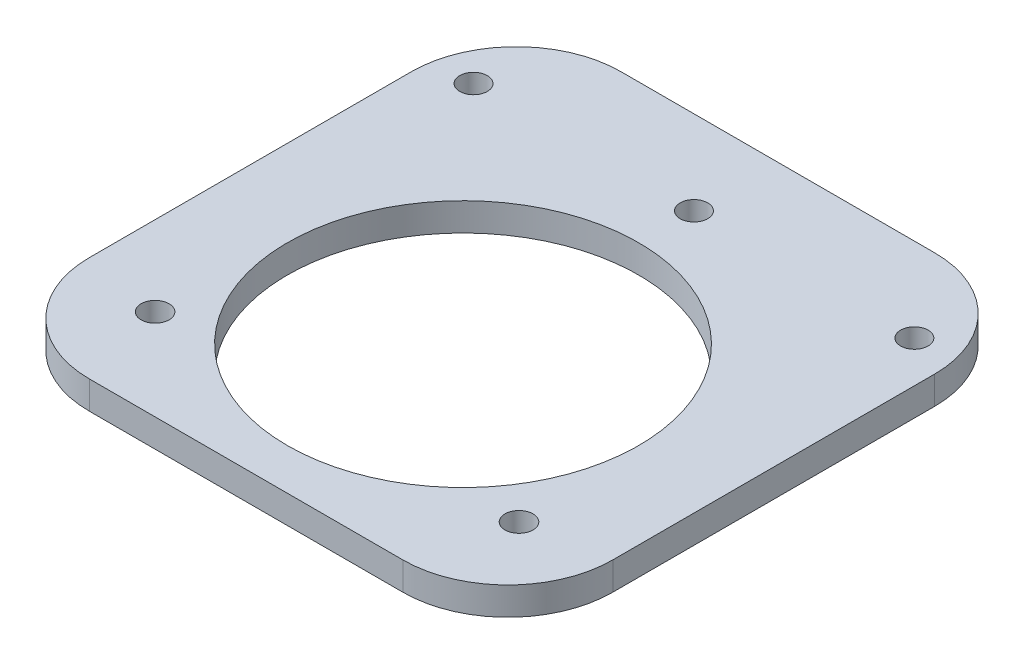
ISO-10303-21;
HEADER;
FILE_DESCRIPTION(('STEP AP214'),'2;1');
FILE_NAME('part.step','',(''),(''),'','','');
FILE_SCHEMA(('AUTOMOTIVE_DESIGN { 1 0 10303 214 1 1 1 1 }'));
ENDSEC;
DATA;
#1=APPLICATION_CONTEXT('core data for automotive mechanical design processes');
#2=APPLICATION_PROTOCOL_DEFINITION('international standard','automotive_design',2000,#1);
#3=PRODUCT_CONTEXT('',#1,'mechanical');
#4=PRODUCT('Part','Part','',(#3));
#5=PRODUCT_RELATED_PRODUCT_CATEGORY('part','',(#4));
#6=PRODUCT_DEFINITION_FORMATION('','',#4);
#7=PRODUCT_DEFINITION_CONTEXT('part definition',#1,'design');
#8=PRODUCT_DEFINITION('design','',#6,#7);
#9=PRODUCT_DEFINITION_SHAPE('','',#8);
#10=(LENGTH_UNIT() NAMED_UNIT(*) SI_UNIT(.MILLI.,.METRE.));
#11=(NAMED_UNIT(*) PLANE_ANGLE_UNIT() SI_UNIT($,.RADIAN.));
#12=(NAMED_UNIT(*) SI_UNIT($,.STERADIAN.) SOLID_ANGLE_UNIT());
#13=UNCERTAINTY_MEASURE_WITH_UNIT(LENGTH_MEASURE(1.E-05),#10,'distance_accuracy_value','');
#14=(GEOMETRIC_REPRESENTATION_CONTEXT(3) GLOBAL_UNCERTAINTY_ASSIGNED_CONTEXT((#13)) GLOBAL_UNIT_ASSIGNED_CONTEXT((#10,
#11,#12)) REPRESENTATION_CONTEXT('',''));
#15=CARTESIAN_POINT('',(0.,0.,0.));
#16=DIRECTION('',(0.,0.,1.));
#17=DIRECTION('',(1.,0.,0.));
#18=AXIS2_PLACEMENT_3D('',#15,#16,#17);
#19=CARTESIAN_POINT('',(-47.5,5.08,-35.56));
#20=DIRECTION('',(0.,0.,1.));
#21=DIRECTION('',(1.,0.,0.));
#22=AXIS2_PLACEMENT_3D('',#19,#20,#21);
#23=PLANE('',#22);
#24=DIRECTION('',(-1.,0.,0.));
#25=VECTOR('',#24,1.);
#26=CARTESIAN_POINT('',(-47.5,5.08,-35.56));
#27=LINE('',#26,#25);
#28=CARTESIAN_POINT('',(28.45,5.08,-35.56));
#29=VERTEX_POINT('',#28);
#30=CARTESIAN_POINT('',(-28.45,5.08,-35.56));
#31=VERTEX_POINT('',#30);
#32=EDGE_CURVE('E132',#29,#31,#27,.T.);
#33=ORIENTED_EDGE('',*,*,#32,.F.);
#34=DIRECTION('',(0.,-1.,0.));
#35=VECTOR('',#34,1.);
#36=CARTESIAN_POINT('',(28.45,5.08,-35.56));
#37=LINE('',#36,#35);
#38=CARTESIAN_POINT('',(28.45,0.,-35.56));
#39=VERTEX_POINT('',#38);
#40=EDGE_CURVE('E116',#29,#39,#37,.T.);
#41=ORIENTED_EDGE('',*,*,#40,.T.);
#42=DIRECTION('',(-1.,0.,0.));
#43=VECTOR('',#42,1.);
#44=CARTESIAN_POINT('',(-47.5,0.,-35.56));
#45=LINE('',#44,#43);
#46=CARTESIAN_POINT('',(-28.45,0.,-35.56));
#47=VERTEX_POINT('',#46);
#48=EDGE_CURVE('E129',#39,#47,#45,.T.);
#49=ORIENTED_EDGE('',*,*,#48,.T.);
#50=DIRECTION('',(0.,-1.,0.));
#51=VECTOR('',#50,1.);
#52=CARTESIAN_POINT('',(-28.45,5.08,-35.56));
#53=LINE('',#52,#51);
#54=EDGE_CURVE('E135',#47,#31,#53,.F.);
#55=ORIENTED_EDGE('',*,*,#54,.T.);
#56=EDGE_LOOP('',(#33,#41,#49,#55));
#57=FACE_BOUND('',#56,.T.);
#58=ADVANCED_FACE('F45',(#57),#23,.F.);
#59=CARTESIAN_POINT('',(-47.5,5.08,60.96));
#60=DIRECTION('',(1.,0.,0.));
#61=DIRECTION('',(0.,0.,-1.));
#62=AXIS2_PLACEMENT_3D('',#59,#60,#61);
#63=PLANE('',#62);
#64=DIRECTION('',(0.,0.,1.));
#65=VECTOR('',#64,1.);
#66=CARTESIAN_POINT('',(-47.5,0.,60.96));
#67=LINE('',#66,#65);
#68=CARTESIAN_POINT('',(-47.5,0.,-16.51));
#69=VERTEX_POINT('',#68);
#70=CARTESIAN_POINT('',(-47.5,0.,41.91));
#71=VERTEX_POINT('',#70);
#72=EDGE_CURVE('E140',#69,#71,#67,.T.);
#73=ORIENTED_EDGE('',*,*,#72,.T.);
#74=DIRECTION('',(0.,-1.,0.));
#75=VECTOR('',#74,1.);
#76=CARTESIAN_POINT('',(-47.5,5.08,41.91));
#77=LINE('',#76,#75);
#78=CARTESIAN_POINT('',(-47.5,5.08,41.91));
#79=VERTEX_POINT('',#78);
#80=EDGE_CURVE('E11',#71,#79,#77,.F.);
#81=ORIENTED_EDGE('',*,*,#80,.T.);
#82=DIRECTION('',(0.,0.,1.));
#83=VECTOR('',#82,1.);
#84=CARTESIAN_POINT('',(-47.5,5.08,60.96));
#85=LINE('',#84,#83);
#86=CARTESIAN_POINT('',(-47.5,5.08,-16.51));
#87=VERTEX_POINT('',#86);
#88=EDGE_CURVE('E207',#87,#79,#85,.T.);
#89=ORIENTED_EDGE('',*,*,#88,.F.);
#90=DIRECTION('',(0.,-1.,0.));
#91=VECTOR('',#90,1.);
#92=CARTESIAN_POINT('',(-47.5,5.08,-16.51));
#93=LINE('',#92,#91);
#94=EDGE_CURVE('E54',#87,#69,#93,.T.);
#95=ORIENTED_EDGE('',*,*,#94,.T.);
#96=EDGE_LOOP('',(#73,#81,#89,#95));
#97=FACE_BOUND('',#96,.T.);
#98=ADVANCED_FACE('F205',(#97),#63,.F.);
#99=CARTESIAN_POINT('',(-47.5,5.08,60.96));
#100=DIRECTION('',(0.,0.,-1.));
#101=DIRECTION('',(-1.,0.,0.));
#102=AXIS2_PLACEMENT_3D('',#99,#100,#101);
#103=PLANE('',#102);
#104=DIRECTION('',(1.,0.,0.));
#105=VECTOR('',#104,1.);
#106=CARTESIAN_POINT('',(-47.5,0.,60.96));
#107=LINE('',#106,#105);
#108=CARTESIAN_POINT('',(-28.45,0.,60.96));
#109=VERTEX_POINT('',#108);
#110=CARTESIAN_POINT('',(28.45,0.,60.96));
#111=VERTEX_POINT('',#110);
#112=EDGE_CURVE('E146',#109,#111,#107,.T.);
#113=ORIENTED_EDGE('',*,*,#112,.T.);
#114=DIRECTION('',(0.,-1.,0.));
#115=VECTOR('',#114,1.);
#116=CARTESIAN_POINT('',(28.45,5.08,60.96));
#117=LINE('',#116,#115);
#118=CARTESIAN_POINT('',(28.45,5.08,60.96));
#119=VERTEX_POINT('',#118);
#120=EDGE_CURVE('E61',#111,#119,#117,.F.);
#121=ORIENTED_EDGE('',*,*,#120,.T.);
#122=DIRECTION('',(1.,0.,0.));
#123=VECTOR('',#122,1.);
#124=CARTESIAN_POINT('',(-47.5,5.08,60.96));
#125=LINE('',#124,#123);
#126=CARTESIAN_POINT('',(-28.45,5.08,60.96));
#127=VERTEX_POINT('',#126);
#128=EDGE_CURVE('E215',#127,#119,#125,.T.);
#129=ORIENTED_EDGE('',*,*,#128,.F.);
#130=DIRECTION('',(0.,-1.,0.));
#131=VECTOR('',#130,1.);
#132=CARTESIAN_POINT('',(-28.45,5.08,60.96));
#133=LINE('',#132,#131);
#134=EDGE_CURVE('E195',#127,#109,#133,.T.);
#135=ORIENTED_EDGE('',*,*,#134,.T.);
#136=EDGE_LOOP('',(#113,#121,#129,#135));
#137=FACE_BOUND('',#136,.T.);
#138=ADVANCED_FACE('F214',(#137),#103,.F.);
#139=CARTESIAN_POINT('',(47.5,5.08,60.96));
#140=DIRECTION('',(-1.,0.,0.));
#141=DIRECTION('',(0.,0.,1.));
#142=AXIS2_PLACEMENT_3D('',#139,#140,#141);
#143=PLANE('',#142);
#144=DIRECTION('',(0.,0.,-1.));
#145=VECTOR('',#144,1.);
#146=CARTESIAN_POINT('',(47.5,0.,60.96));
#147=LINE('',#146,#145);
#148=CARTESIAN_POINT('',(47.5,0.,41.91));
#149=VERTEX_POINT('',#148);
#150=CARTESIAN_POINT('',(47.5,0.,-16.51));
#151=VERTEX_POINT('',#150);
#152=EDGE_CURVE('E157',#149,#151,#147,.T.);
#153=ORIENTED_EDGE('',*,*,#152,.T.);
#154=DIRECTION('',(0.,-1.,0.));
#155=VECTOR('',#154,1.);
#156=CARTESIAN_POINT('',(47.5,5.08,-16.51));
#157=LINE('',#156,#155);
#158=CARTESIAN_POINT('',(47.5,5.08,-16.51));
#159=VERTEX_POINT('',#158);
#160=EDGE_CURVE('E117',#151,#159,#157,.F.);
#161=ORIENTED_EDGE('',*,*,#160,.T.);
#162=DIRECTION('',(0.,0.,-1.));
#163=VECTOR('',#162,1.);
#164=CARTESIAN_POINT('',(47.5,5.08,60.96));
#165=LINE('',#164,#163);
#166=CARTESIAN_POINT('',(47.5,5.08,41.91));
#167=VERTEX_POINT('',#166);
#168=EDGE_CURVE('E152',#167,#159,#165,.T.);
#169=ORIENTED_EDGE('',*,*,#168,.F.);
#170=DIRECTION('',(0.,-1.,0.));
#171=VECTOR('',#170,1.);
#172=CARTESIAN_POINT('',(47.5,5.08,41.91));
#173=LINE('',#172,#171);
#174=EDGE_CURVE('E123',#167,#149,#173,.T.);
#175=ORIENTED_EDGE('',*,*,#174,.T.);
#176=EDGE_LOOP('',(#153,#161,#169,#175));
#177=FACE_BOUND('',#176,.T.);
#178=ADVANCED_FACE('F265',(#177),#143,.F.);
#179=CARTESIAN_POINT('',(0.,5.08,0.));
#180=DIRECTION('',(0.,1.,0.));
#181=DIRECTION('',(0.,0.,1.));
#182=AXIS2_PLACEMENT_3D('',#179,#180,#181);
#183=PLANE('',#182);
#184=CARTESIAN_POINT('',(-33.02,5.08,44.45));
#185=DIRECTION('',(0.,1.,0.));
#186=DIRECTION('',(0.,0.,1.));
#187=AXIS2_PLACEMENT_3D('',#184,#185,#186);
#188=CIRCLE('',#187,2.54);
#189=CARTESIAN_POINT('',(-33.02,5.08,46.99));
#190=VERTEX_POINT('',#189);
#191=EDGE_CURVE('E165',#190,#190,#188,.T.);
#192=ORIENTED_EDGE('',*,*,#191,.F.);
#193=EDGE_LOOP('',(#192));
#194=FACE_BOUND('',#193,.T.);
#195=CARTESIAN_POINT('',(33.02,5.08,44.45));
#196=DIRECTION('',(0.,1.,0.));
#197=DIRECTION('',(0.,0.,-1.));
#198=AXIS2_PLACEMENT_3D('',#195,#196,#197);
#199=CIRCLE('',#198,2.54);
#200=CARTESIAN_POINT('',(33.02,5.08,41.91));
#201=VERTEX_POINT('',#200);
#202=EDGE_CURVE('E251',#201,#201,#199,.T.);
#203=ORIENTED_EDGE('',*,*,#202,.F.);
#204=EDGE_LOOP('',(#203));
#205=FACE_BOUND('',#204,.T.);
#206=CARTESIAN_POINT('',(-40.,5.08,-20.32));
#207=DIRECTION('',(0.,1.,0.));
#208=DIRECTION('',(0.,0.,1.));
#209=AXIS2_PLACEMENT_3D('',#206,#207,#208);
#210=CIRCLE('',#209,2.5);
#211=CARTESIAN_POINT('',(-40.,5.08,-17.82));
#212=VERTEX_POINT('',#211);
#213=EDGE_CURVE('E169',#212,#212,#210,.T.);
#214=ORIENTED_EDGE('',*,*,#213,.F.);
#215=EDGE_LOOP('',(#214));
#216=FACE_BOUND('',#215,.T.);
#217=CARTESIAN_POINT('',(40.,5.08,-20.32));
#218=DIRECTION('',(0.,1.,0.));
#219=DIRECTION('',(0.,0.,1.));
#220=AXIS2_PLACEMENT_3D('',#217,#218,#219);
#221=CIRCLE('',#220,2.5);
#222=CARTESIAN_POINT('',(40.,5.08,-17.82));
#223=VERTEX_POINT('',#222);
#224=EDGE_CURVE('E240',#223,#223,#221,.T.);
#225=ORIENTED_EDGE('',*,*,#224,.F.);
#226=EDGE_LOOP('',(#225));
#227=FACE_BOUND('',#226,.T.);
#228=CARTESIAN_POINT('',(0.,5.08,-20.32));
#229=DIRECTION('',(0.,1.,0.));
#230=DIRECTION('',(0.,0.,1.));
#231=AXIS2_PLACEMENT_3D('',#228,#229,#230);
#232=CIRCLE('',#231,2.5);
#233=CARTESIAN_POINT('',(0.,5.08,-17.82));
#234=VERTEX_POINT('',#233);
#235=EDGE_CURVE('E232',#234,#234,#232,.T.);
#236=ORIENTED_EDGE('',*,*,#235,.F.);
#237=EDGE_LOOP('',(#236));
#238=FACE_BOUND('',#237,.T.);
#239=CARTESIAN_POINT('',(0.,5.08,21.59));
#240=DIRECTION('',(0.,1.,0.));
#241=DIRECTION('',(0.,0.,1.));
#242=AXIS2_PLACEMENT_3D('',#239,#240,#241);
#243=CIRCLE('',#242,31.879999994);
#244=CARTESIAN_POINT('',(0.,5.08,53.469999994));
#245=VERTEX_POINT('',#244);
#246=EDGE_CURVE('E149',#245,#245,#243,.T.);
#247=ORIENTED_EDGE('',*,*,#246,.F.);
#248=EDGE_LOOP('',(#247));
#249=FACE_BOUND('',#248,.T.);
#250=ORIENTED_EDGE('',*,*,#168,.T.);
#251=CARTESIAN_POINT('',(28.45,5.08,-16.51));
#252=DIRECTION('',(0.,1.,0.));
#253=DIRECTION('',(0.,0.,1.));
#254=AXIS2_PLACEMENT_3D('',#251,#252,#253);
#255=CIRCLE('',#254,19.05);
#256=EDGE_CURVE('E192',#159,#29,#255,.T.);
#257=ORIENTED_EDGE('',*,*,#256,.T.);
#258=ORIENTED_EDGE('',*,*,#32,.T.);
#259=CARTESIAN_POINT('',(-28.45,5.08,-16.51));
#260=DIRECTION('',(0.,1.,0.));
#261=DIRECTION('',(0.,0.,1.));
#262=AXIS2_PLACEMENT_3D('',#259,#260,#261);
#263=CIRCLE('',#262,19.05);
#264=EDGE_CURVE('E184',#31,#87,#263,.T.);
#265=ORIENTED_EDGE('',*,*,#264,.T.);
#266=ORIENTED_EDGE('',*,*,#88,.T.);
#267=CARTESIAN_POINT('',(-28.45,5.08,41.91));
#268=DIRECTION('',(0.,1.,0.));
#269=DIRECTION('',(0.,0.,1.));
#270=AXIS2_PLACEMENT_3D('',#267,#268,#269);
#271=CIRCLE('',#270,19.05);
#272=EDGE_CURVE('E68',#79,#127,#271,.T.);
#273=ORIENTED_EDGE('',*,*,#272,.T.);
#274=ORIENTED_EDGE('',*,*,#128,.T.);
#275=CARTESIAN_POINT('',(28.45,5.08,41.91));
#276=DIRECTION('',(0.,1.,0.));
#277=DIRECTION('',(0.,0.,1.));
#278=AXIS2_PLACEMENT_3D('',#275,#276,#277);
#279=CIRCLE('',#278,19.05);
#280=EDGE_CURVE('E189',#119,#167,#279,.T.);
#281=ORIENTED_EDGE('',*,*,#280,.T.);
#282=EDGE_LOOP('',(#250,#257,#258,#265,#266,#273,#274,#281));
#283=FACE_BOUND('',#282,.T.);
#284=ADVANCED_FACE('F262',(#194,#205,#216,#227,#238,#249,#283),#183,.T.);
#285=CARTESIAN_POINT('',(0.,0.,0.));
#286=DIRECTION('',(0.,1.,0.));
#287=DIRECTION('',(0.,0.,1.));
#288=AXIS2_PLACEMENT_3D('',#285,#286,#287);
#289=PLANE('',#288);
#290=CARTESIAN_POINT('',(-33.02,0.,44.45));
#291=DIRECTION('',(0.,1.,0.));
#292=DIRECTION('',(0.,0.,1.));
#293=AXIS2_PLACEMENT_3D('',#290,#291,#292);
#294=CIRCLE('',#293,2.54);
#295=CARTESIAN_POINT('',(-33.02,0.,46.99));
#296=VERTEX_POINT('',#295);
#297=EDGE_CURVE('E164',#296,#296,#294,.T.);
#298=ORIENTED_EDGE('',*,*,#297,.T.);
#299=EDGE_LOOP('',(#298));
#300=FACE_BOUND('',#299,.T.);
#301=CARTESIAN_POINT('',(33.02,0.,44.45));
#302=DIRECTION('',(0.,1.,0.));
#303=DIRECTION('',(0.,0.,1.));
#304=AXIS2_PLACEMENT_3D('',#301,#302,#303);
#305=CIRCLE('',#304,2.54);
#306=CARTESIAN_POINT('',(33.02,0.,46.99));
#307=VERTEX_POINT('',#306);
#308=EDGE_CURVE('E160',#307,#307,#305,.T.);
#309=ORIENTED_EDGE('',*,*,#308,.T.);
#310=EDGE_LOOP('',(#309));
#311=FACE_BOUND('',#310,.T.);
#312=CARTESIAN_POINT('',(-40.,0.,-20.32));
#313=DIRECTION('',(0.,1.,0.));
#314=DIRECTION('',(0.,0.,1.));
#315=AXIS2_PLACEMENT_3D('',#312,#313,#314);
#316=CIRCLE('',#315,2.5);
#317=CARTESIAN_POINT('',(-40.,0.,-17.82));
#318=VERTEX_POINT('',#317);
#319=EDGE_CURVE('E244',#318,#318,#316,.T.);
#320=ORIENTED_EDGE('',*,*,#319,.T.);
#321=EDGE_LOOP('',(#320));
#322=FACE_BOUND('',#321,.T.);
#323=CARTESIAN_POINT('',(40.,0.,-20.32));
#324=DIRECTION('',(0.,1.,0.));
#325=DIRECTION('',(0.,0.,1.));
#326=AXIS2_PLACEMENT_3D('',#323,#324,#325);
#327=CIRCLE('',#326,2.5);
#328=CARTESIAN_POINT('',(40.,0.,-17.82));
#329=VERTEX_POINT('',#328);
#330=EDGE_CURVE('E236',#329,#329,#327,.T.);
#331=ORIENTED_EDGE('',*,*,#330,.T.);
#332=EDGE_LOOP('',(#331));
#333=FACE_BOUND('',#332,.T.);
#334=CARTESIAN_POINT('',(0.,0.,-20.32));
#335=DIRECTION('',(0.,1.,0.));
#336=DIRECTION('',(0.,0.,1.));
#337=AXIS2_PLACEMENT_3D('',#334,#335,#336);
#338=CIRCLE('',#337,2.5);
#339=CARTESIAN_POINT('',(0.,0.,-17.82));
#340=VERTEX_POINT('',#339);
#341=EDGE_CURVE('E227',#340,#340,#338,.T.);
#342=ORIENTED_EDGE('',*,*,#341,.T.);
#343=EDGE_LOOP('',(#342));
#344=FACE_BOUND('',#343,.T.);
#345=CARTESIAN_POINT('',(0.,0.,21.59));
#346=DIRECTION('',(0.,1.,0.));
#347=DIRECTION('',(0.,0.,1.));
#348=AXIS2_PLACEMENT_3D('',#345,#346,#347);
#349=CIRCLE('',#348,31.879999994);
#350=CARTESIAN_POINT('',(0.,0.,53.469999994));
#351=VERTEX_POINT('',#350);
#352=EDGE_CURVE('E141',#351,#351,#349,.T.);
#353=ORIENTED_EDGE('',*,*,#352,.T.);
#354=EDGE_LOOP('',(#353));
#355=FACE_BOUND('',#354,.T.);
#356=ORIENTED_EDGE('',*,*,#48,.F.);
#357=CARTESIAN_POINT('',(28.45,0.,-16.51));
#358=DIRECTION('',(0.,1.,0.));
#359=DIRECTION('',(0.,0.,1.));
#360=AXIS2_PLACEMENT_3D('',#357,#358,#359);
#361=CIRCLE('',#360,19.05);
#362=EDGE_CURVE('E112',#39,#151,#361,.F.);
#363=ORIENTED_EDGE('',*,*,#362,.T.);
#364=ORIENTED_EDGE('',*,*,#152,.F.);
#365=CARTESIAN_POINT('',(28.45,0.,41.91));
#366=DIRECTION('',(0.,1.,0.));
#367=DIRECTION('',(0.,0.,1.));
#368=AXIS2_PLACEMENT_3D('',#365,#366,#367);
#369=CIRCLE('',#368,19.05);
#370=EDGE_CURVE('E124',#149,#111,#369,.F.);
#371=ORIENTED_EDGE('',*,*,#370,.T.);
#372=ORIENTED_EDGE('',*,*,#112,.F.);
#373=CARTESIAN_POINT('',(-28.45,0.,41.91));
#374=DIRECTION('',(0.,1.,0.));
#375=DIRECTION('',(0.,0.,1.));
#376=AXIS2_PLACEMENT_3D('',#373,#374,#375);
#377=CIRCLE('',#376,19.05);
#378=EDGE_CURVE('E174',#109,#71,#377,.F.);
#379=ORIENTED_EDGE('',*,*,#378,.T.);
#380=ORIENTED_EDGE('',*,*,#72,.F.);
#381=CARTESIAN_POINT('',(-28.45,0.,-16.51));
#382=DIRECTION('',(0.,1.,0.));
#383=DIRECTION('',(0.,0.,1.));
#384=AXIS2_PLACEMENT_3D('',#381,#382,#383);
#385=CIRCLE('',#384,19.05);
#386=EDGE_CURVE('E134',#69,#47,#385,.F.);
#387=ORIENTED_EDGE('',*,*,#386,.T.);
#388=EDGE_LOOP('',(#356,#363,#364,#371,#372,#379,#380,#387));
#389=FACE_BOUND('',#388,.T.);
#390=ADVANCED_FACE('F137',(#300,#311,#322,#333,#344,#355,#389),#289,.F.);
#391=CARTESIAN_POINT('',(0.,0.,21.59));
#392=DIRECTION('',(0.,1.,0.));
#393=DIRECTION('',(0.,0.,1.));
#394=AXIS2_PLACEMENT_3D('',#391,#392,#393);
#395=CYLINDRICAL_SURFACE('',#394,31.879999994);
#396=ORIENTED_EDGE('',*,*,#352,.F.);
#397=EDGE_LOOP('',(#396));
#398=FACE_BOUND('',#397,.T.);
#399=ORIENTED_EDGE('',*,*,#246,.T.);
#400=EDGE_LOOP('',(#399));
#401=FACE_BOUND('',#400,.T.);
#402=ADVANCED_FACE('F301',(#398,#401),#395,.F.);
#403=CARTESIAN_POINT('',(0.,5.08,-20.32));
#404=DIRECTION('',(0.,1.,0.));
#405=DIRECTION('',(0.,0.,1.));
#406=AXIS2_PLACEMENT_3D('',#403,#404,#405);
#407=CYLINDRICAL_SURFACE('',#406,2.5);
#408=ORIENTED_EDGE('',*,*,#341,.F.);
#409=EDGE_LOOP('',(#408));
#410=FACE_BOUND('',#409,.T.);
#411=ORIENTED_EDGE('',*,*,#235,.T.);
#412=EDGE_LOOP('',(#411));
#413=FACE_BOUND('',#412,.T.);
#414=ADVANCED_FACE('F306',(#410,#413),#407,.F.);
#415=CARTESIAN_POINT('',(40.,5.08,-20.32));
#416=DIRECTION('',(0.,1.,0.));
#417=DIRECTION('',(0.,0.,1.));
#418=AXIS2_PLACEMENT_3D('',#415,#416,#417);
#419=CYLINDRICAL_SURFACE('',#418,2.5);
#420=ORIENTED_EDGE('',*,*,#330,.F.);
#421=EDGE_LOOP('',(#420));
#422=FACE_BOUND('',#421,.T.);
#423=ORIENTED_EDGE('',*,*,#224,.T.);
#424=EDGE_LOOP('',(#423));
#425=FACE_BOUND('',#424,.T.);
#426=ADVANCED_FACE('F310',(#422,#425),#419,.F.);
#427=CARTESIAN_POINT('',(-40.,5.08,-20.32));
#428=DIRECTION('',(0.,1.,0.));
#429=DIRECTION('',(0.,0.,1.));
#430=AXIS2_PLACEMENT_3D('',#427,#428,#429);
#431=CYLINDRICAL_SURFACE('',#430,2.5);
#432=ORIENTED_EDGE('',*,*,#319,.F.);
#433=EDGE_LOOP('',(#432));
#434=FACE_BOUND('',#433,.T.);
#435=ORIENTED_EDGE('',*,*,#213,.T.);
#436=EDGE_LOOP('',(#435));
#437=FACE_BOUND('',#436,.T.);
#438=ADVANCED_FACE('F314',(#434,#437),#431,.F.);
#439=CARTESIAN_POINT('',(33.02,-2.54,44.45));
#440=DIRECTION('',(0.,1.,0.));
#441=DIRECTION('',(0.,0.,1.));
#442=AXIS2_PLACEMENT_3D('',#439,#440,#441);
#443=CYLINDRICAL_SURFACE('',#442,2.54);
#444=ORIENTED_EDGE('',*,*,#202,.T.);
#445=EDGE_LOOP('',(#444));
#446=FACE_BOUND('',#445,.T.);
#447=ORIENTED_EDGE('',*,*,#308,.F.);
#448=EDGE_LOOP('',(#447));
#449=FACE_BOUND('',#448,.T.);
#450=ADVANCED_FACE('F318',(#446,#449),#443,.F.);
#451=CARTESIAN_POINT('',(-33.02,-2.54,44.45));
#452=DIRECTION('',(0.,1.,0.));
#453=DIRECTION('',(0.,0.,1.));
#454=AXIS2_PLACEMENT_3D('',#451,#452,#453);
#455=CYLINDRICAL_SURFACE('',#454,2.54);
#456=ORIENTED_EDGE('',*,*,#191,.T.);
#457=EDGE_LOOP('',(#456));
#458=FACE_BOUND('',#457,.T.);
#459=ORIENTED_EDGE('',*,*,#297,.F.);
#460=EDGE_LOOP('',(#459));
#461=FACE_BOUND('',#460,.T.);
#462=ADVANCED_FACE('F259',(#458,#461),#455,.F.);
#463=CARTESIAN_POINT('',(28.45,5.08,-16.51));
#464=DIRECTION('',(0.,-1.,0.));
#465=DIRECTION('',(0.,0.,-1.));
#466=AXIS2_PLACEMENT_3D('',#463,#464,#465);
#467=CYLINDRICAL_SURFACE('',#466,19.05);
#468=ORIENTED_EDGE('',*,*,#256,.F.);
#469=ORIENTED_EDGE('',*,*,#160,.F.);
#470=ORIENTED_EDGE('',*,*,#362,.F.);
#471=ORIENTED_EDGE('',*,*,#40,.F.);
#472=EDGE_LOOP('',(#468,#469,#470,#471));
#473=FACE_BOUND('',#472,.T.);
#474=ADVANCED_FACE('F115',(#473),#467,.T.);
#475=CARTESIAN_POINT('',(28.45,5.08,41.91));
#476=DIRECTION('',(0.,-1.,0.));
#477=DIRECTION('',(0.,0.,-1.));
#478=AXIS2_PLACEMENT_3D('',#475,#476,#477);
#479=CYLINDRICAL_SURFACE('',#478,19.05);
#480=ORIENTED_EDGE('',*,*,#280,.F.);
#481=ORIENTED_EDGE('',*,*,#120,.F.);
#482=ORIENTED_EDGE('',*,*,#370,.F.);
#483=ORIENTED_EDGE('',*,*,#174,.F.);
#484=EDGE_LOOP('',(#480,#481,#482,#483));
#485=FACE_BOUND('',#484,.T.);
#486=ADVANCED_FACE('F280',(#485),#479,.T.);
#487=CARTESIAN_POINT('',(-28.45,5.08,41.91));
#488=DIRECTION('',(0.,-1.,0.));
#489=DIRECTION('',(0.,0.,-1.));
#490=AXIS2_PLACEMENT_3D('',#487,#488,#489);
#491=CYLINDRICAL_SURFACE('',#490,19.05);
#492=ORIENTED_EDGE('',*,*,#272,.F.);
#493=ORIENTED_EDGE('',*,*,#80,.F.);
#494=ORIENTED_EDGE('',*,*,#378,.F.);
#495=ORIENTED_EDGE('',*,*,#134,.F.);
#496=EDGE_LOOP('',(#492,#493,#494,#495));
#497=FACE_BOUND('',#496,.T.);
#498=ADVANCED_FACE('F213',(#497),#491,.T.);
#499=CARTESIAN_POINT('',(-28.45,5.08,-16.51));
#500=DIRECTION('',(0.,-1.,0.));
#501=DIRECTION('',(0.,0.,-1.));
#502=AXIS2_PLACEMENT_3D('',#499,#500,#501);
#503=CYLINDRICAL_SURFACE('',#502,19.05);
#504=ORIENTED_EDGE('',*,*,#264,.F.);
#505=ORIENTED_EDGE('',*,*,#54,.F.);
#506=ORIENTED_EDGE('',*,*,#386,.F.);
#507=ORIENTED_EDGE('',*,*,#94,.F.);
#508=EDGE_LOOP('',(#504,#505,#506,#507));
#509=FACE_BOUND('',#508,.T.);
#510=ADVANCED_FACE('F47',(#509),#503,.T.);
#511=CLOSED_SHELL('',(#58,#98,#138,#178,#284,#390,#402,#414,#426,#438,#450,#462,#474,#486,#498,#510));
#512=MANIFOLD_SOLID_BREP('B2',#511);
#513=ADVANCED_BREP_SHAPE_REPRESENTATION('',(#18,#512),#14);
#514=SHAPE_DEFINITION_REPRESENTATION(#9,#513);
ENDSEC;
END-ISO-10303-21;
